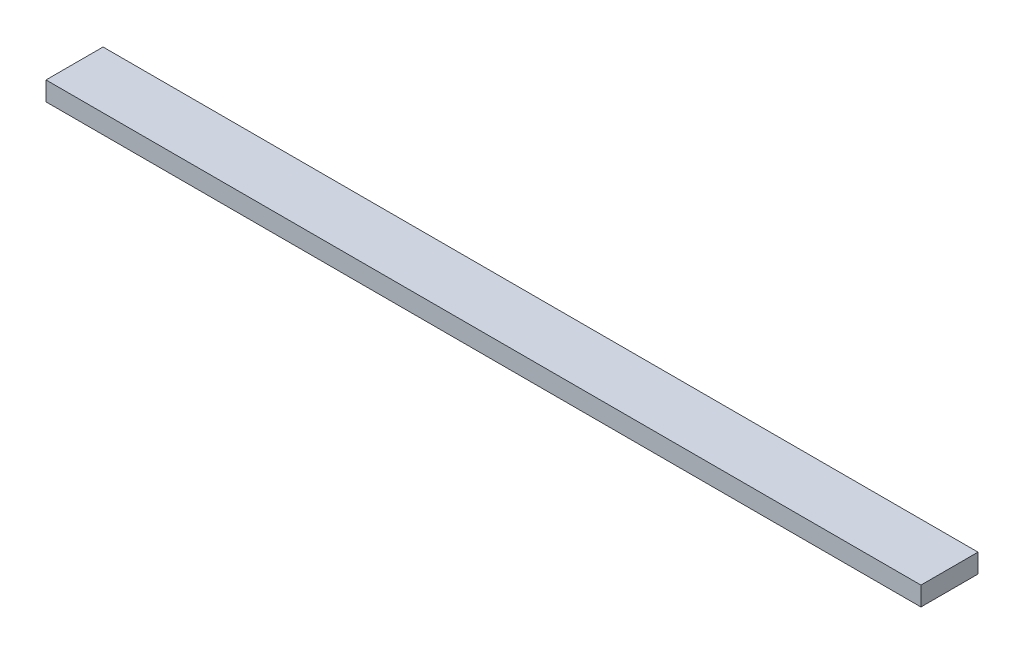
ISO-10303-21;
HEADER;
FILE_DESCRIPTION(('STEP AP214'),'2;1');
FILE_NAME('part.step','',(''),(''),'','','');
FILE_SCHEMA(('AUTOMOTIVE_DESIGN { 1 0 10303 214 1 1 1 1 }'));
ENDSEC;
DATA;
#1=APPLICATION_CONTEXT('core data for automotive mechanical design processes');
#2=APPLICATION_PROTOCOL_DEFINITION('international standard','automotive_design',2000,#1);
#3=PRODUCT_CONTEXT('',#1,'mechanical');
#4=PRODUCT('Part','Part','',(#3));
#5=PRODUCT_RELATED_PRODUCT_CATEGORY('part','',(#4));
#6=PRODUCT_DEFINITION_FORMATION('','',#4);
#7=PRODUCT_DEFINITION_CONTEXT('part definition',#1,'design');
#8=PRODUCT_DEFINITION('design','',#6,#7);
#9=PRODUCT_DEFINITION_SHAPE('','',#8);
#10=(LENGTH_UNIT() NAMED_UNIT(*) SI_UNIT(.MILLI.,.METRE.));
#11=(NAMED_UNIT(*) PLANE_ANGLE_UNIT() SI_UNIT($,.RADIAN.));
#12=(NAMED_UNIT(*) SI_UNIT($,.STERADIAN.) SOLID_ANGLE_UNIT());
#13=UNCERTAINTY_MEASURE_WITH_UNIT(LENGTH_MEASURE(1.E-05),#10,'distance_accuracy_value','');
#14=(GEOMETRIC_REPRESENTATION_CONTEXT(3) GLOBAL_UNCERTAINTY_ASSIGNED_CONTEXT((#13)) GLOBAL_UNIT_ASSIGNED_CONTEXT((#10,
#11,#12)) REPRESENTATION_CONTEXT('',''));
#15=CARTESIAN_POINT('',(0.,0.,0.));
#16=DIRECTION('',(0.,0.,1.));
#17=DIRECTION('',(1.,0.,0.));
#18=AXIS2_PLACEMENT_3D('',#15,#16,#17);
#19=CARTESIAN_POINT('',(0.,50.,0.));
#20=DIRECTION('',(1.,0.,0.));
#21=DIRECTION('',(0.,0.,-1.));
#22=AXIS2_PLACEMENT_3D('',#19,#20,#21);
#23=PLANE('',#22);
#24=DIRECTION('',(0.,0.,1.));
#25=VECTOR('',#24,1.);
#26=CARTESIAN_POINT('',(0.,0.,0.));
#27=LINE('',#26,#25);
#28=CARTESIAN_POINT('',(0.,0.,-150.));
#29=VERTEX_POINT('',#28);
#30=CARTESIAN_POINT('',(0.,0.,0.));
#31=VERTEX_POINT('',#30);
#32=EDGE_CURVE('E114',#29,#31,#27,.T.);
#33=ORIENTED_EDGE('',*,*,#32,.T.);
#34=DIRECTION('',(0.,-1.,0.));
#35=VECTOR('',#34,1.);
#36=CARTESIAN_POINT('',(0.,50.,0.));
#37=LINE('',#36,#35);
#38=CARTESIAN_POINT('',(0.,50.,0.));
#39=VERTEX_POINT('',#38);
#40=EDGE_CURVE('E11',#39,#31,#37,.T.);
#41=ORIENTED_EDGE('',*,*,#40,.F.);
#42=DIRECTION('',(0.,0.,1.));
#43=VECTOR('',#42,1.);
#44=CARTESIAN_POINT('',(0.,50.,0.));
#45=LINE('',#44,#43);
#46=CARTESIAN_POINT('',(0.,50.,-150.));
#47=VERTEX_POINT('',#46);
#48=EDGE_CURVE('E100',#47,#39,#45,.T.);
#49=ORIENTED_EDGE('',*,*,#48,.F.);
#50=DIRECTION('',(0.,-1.,0.));
#51=VECTOR('',#50,1.);
#52=CARTESIAN_POINT('',(0.,50.,-150.));
#53=LINE('',#52,#51);
#54=EDGE_CURVE('E108',#47,#29,#53,.T.);
#55=ORIENTED_EDGE('',*,*,#54,.T.);
#56=EDGE_LOOP('',(#33,#41,#49,#55));
#57=FACE_BOUND('',#56,.T.);
#58=ADVANCED_FACE('F44',(#57),#23,.F.);
#59=CARTESIAN_POINT('',(0.,50.,0.));
#60=DIRECTION('',(0.,0.,-1.));
#61=DIRECTION('',(-1.,0.,0.));
#62=AXIS2_PLACEMENT_3D('',#59,#60,#61);
#63=PLANE('',#62);
#64=DIRECTION('',(1.,0.,0.));
#65=VECTOR('',#64,1.);
#66=CARTESIAN_POINT('',(0.,0.,0.));
#67=LINE('',#66,#65);
#68=CARTESIAN_POINT('',(2300.,0.,0.));
#69=VERTEX_POINT('',#68);
#70=EDGE_CURVE('E105',#31,#69,#67,.T.);
#71=ORIENTED_EDGE('',*,*,#70,.T.);
#72=DIRECTION('',(0.,-1.,0.));
#73=VECTOR('',#72,1.);
#74=CARTESIAN_POINT('',(2300.,50.,0.));
#75=LINE('',#74,#73);
#76=CARTESIAN_POINT('',(2300.,50.,0.));
#77=VERTEX_POINT('',#76);
#78=EDGE_CURVE('E53',#77,#69,#75,.T.);
#79=ORIENTED_EDGE('',*,*,#78,.F.);
#80=DIRECTION('',(1.,0.,0.));
#81=VECTOR('',#80,1.);
#82=CARTESIAN_POINT('',(0.,50.,0.));
#83=LINE('',#82,#81);
#84=EDGE_CURVE('E95',#39,#77,#83,.T.);
#85=ORIENTED_EDGE('',*,*,#84,.F.);
#86=ORIENTED_EDGE('',*,*,#40,.T.);
#87=EDGE_LOOP('',(#71,#79,#85,#86));
#88=FACE_BOUND('',#87,.T.);
#89=ADVANCED_FACE('F101',(#88),#63,.F.);
#90=CARTESIAN_POINT('',(2300.,50.,0.));
#91=DIRECTION('',(-1.,0.,0.));
#92=DIRECTION('',(0.,0.,1.));
#93=AXIS2_PLACEMENT_3D('',#90,#91,#92);
#94=PLANE('',#93);
#95=DIRECTION('',(0.,0.,-1.));
#96=VECTOR('',#95,1.);
#97=CARTESIAN_POINT('',(2300.,0.,0.));
#98=LINE('',#97,#96);
#99=CARTESIAN_POINT('',(2300.,0.,-150.));
#100=VERTEX_POINT('',#99);
#101=EDGE_CURVE('E76',#69,#100,#98,.T.);
#102=ORIENTED_EDGE('',*,*,#101,.T.);
#103=DIRECTION('',(0.,-1.,0.));
#104=VECTOR('',#103,1.);
#105=CARTESIAN_POINT('',(2300.,50.,-150.));
#106=LINE('',#105,#104);
#107=CARTESIAN_POINT('',(2300.,50.,-150.));
#108=VERTEX_POINT('',#107);
#109=EDGE_CURVE('E102',#108,#100,#106,.T.);
#110=ORIENTED_EDGE('',*,*,#109,.F.);
#111=DIRECTION('',(0.,0.,-1.));
#112=VECTOR('',#111,1.);
#113=CARTESIAN_POINT('',(2300.,50.,0.));
#114=LINE('',#113,#112);
#115=EDGE_CURVE('E92',#77,#108,#114,.T.);
#116=ORIENTED_EDGE('',*,*,#115,.F.);
#117=ORIENTED_EDGE('',*,*,#78,.T.);
#118=EDGE_LOOP('',(#102,#110,#116,#117));
#119=FACE_BOUND('',#118,.T.);
#120=ADVANCED_FACE('F104',(#119),#94,.F.);
#121=CARTESIAN_POINT('',(0.,50.,-150.));
#122=DIRECTION('',(0.,0.,1.));
#123=DIRECTION('',(1.,0.,0.));
#124=AXIS2_PLACEMENT_3D('',#121,#122,#123);
#125=PLANE('',#124);
#126=DIRECTION('',(-1.,0.,0.));
#127=VECTOR('',#126,1.);
#128=CARTESIAN_POINT('',(0.,0.,-150.));
#129=LINE('',#128,#127);
#130=EDGE_CURVE('E81',#100,#29,#129,.T.);
#131=ORIENTED_EDGE('',*,*,#130,.T.);
#132=ORIENTED_EDGE('',*,*,#54,.F.);
#133=DIRECTION('',(-1.,0.,0.));
#134=VECTOR('',#133,1.);
#135=CARTESIAN_POINT('',(0.,50.,-150.));
#136=LINE('',#135,#134);
#137=EDGE_CURVE('E65',#108,#47,#136,.T.);
#138=ORIENTED_EDGE('',*,*,#137,.F.);
#139=ORIENTED_EDGE('',*,*,#109,.T.);
#140=EDGE_LOOP('',(#131,#132,#138,#139));
#141=FACE_BOUND('',#140,.T.);
#142=ADVANCED_FACE('F127',(#141),#125,.F.);
#143=CARTESIAN_POINT('',(0.,50.,0.));
#144=DIRECTION('',(0.,-1.,0.));
#145=DIRECTION('',(0.,0.,-1.));
#146=AXIS2_PLACEMENT_3D('',#143,#144,#145);
#147=PLANE('',#146);
#148=ORIENTED_EDGE('',*,*,#48,.T.);
#149=ORIENTED_EDGE('',*,*,#84,.T.);
#150=ORIENTED_EDGE('',*,*,#115,.T.);
#151=ORIENTED_EDGE('',*,*,#137,.T.);
#152=EDGE_LOOP('',(#148,#149,#150,#151));
#153=FACE_BOUND('',#152,.T.);
#154=ADVANCED_FACE('F91',(#153),#147,.F.);
#155=CARTESIAN_POINT('',(0.,0.,0.));
#156=DIRECTION('',(0.,-1.,0.));
#157=DIRECTION('',(0.,0.,-1.));
#158=AXIS2_PLACEMENT_3D('',#155,#156,#157);
#159=PLANE('',#158);
#160=ORIENTED_EDGE('',*,*,#32,.F.);
#161=ORIENTED_EDGE('',*,*,#130,.F.);
#162=ORIENTED_EDGE('',*,*,#101,.F.);
#163=ORIENTED_EDGE('',*,*,#70,.F.);
#164=EDGE_LOOP('',(#160,#161,#162,#163));
#165=FACE_BOUND('',#164,.T.);
#166=ADVANCED_FACE('F129',(#165),#159,.T.);
#167=CLOSED_SHELL('',(#58,#89,#120,#142,#154,#166));
#168=MANIFOLD_SOLID_BREP('B2',#167);
#169=ADVANCED_BREP_SHAPE_REPRESENTATION('',(#18,#168),#14);
#170=SHAPE_DEFINITION_REPRESENTATION(#9,#169);
ENDSEC;
END-ISO-10303-21;
